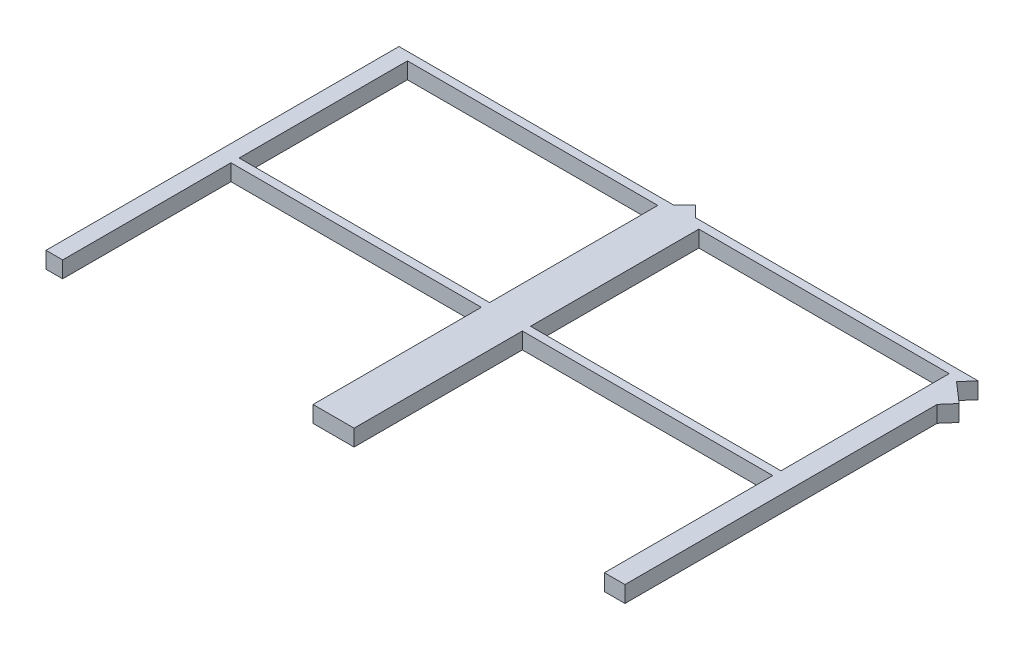
ISO-10303-21;
HEADER;
FILE_DESCRIPTION(('STEP AP214'),'2;1');
FILE_NAME('part.step','',(''),(''),'','','');
FILE_SCHEMA(('AUTOMOTIVE_DESIGN { 1 0 10303 214 1 1 1 1 }'));
ENDSEC;
DATA;
#1=APPLICATION_CONTEXT('core data for automotive mechanical design processes');
#2=APPLICATION_PROTOCOL_DEFINITION('international standard','automotive_design',2000,#1);
#3=PRODUCT_CONTEXT('',#1,'mechanical');
#4=PRODUCT('Part','Part','',(#3));
#5=PRODUCT_RELATED_PRODUCT_CATEGORY('part','',(#4));
#6=PRODUCT_DEFINITION_FORMATION('','',#4);
#7=PRODUCT_DEFINITION_CONTEXT('part definition',#1,'design');
#8=PRODUCT_DEFINITION('design','',#6,#7);
#9=PRODUCT_DEFINITION_SHAPE('','',#8);
#10=(LENGTH_UNIT() NAMED_UNIT(*) SI_UNIT(.MILLI.,.METRE.));
#11=(NAMED_UNIT(*) PLANE_ANGLE_UNIT() SI_UNIT($,.RADIAN.));
#12=(NAMED_UNIT(*) SI_UNIT($,.STERADIAN.) SOLID_ANGLE_UNIT());
#13=UNCERTAINTY_MEASURE_WITH_UNIT(LENGTH_MEASURE(1.E-05),#10,'distance_accuracy_value','');
#14=(GEOMETRIC_REPRESENTATION_CONTEXT(3) GLOBAL_UNCERTAINTY_ASSIGNED_CONTEXT((#13)) GLOBAL_UNIT_ASSIGNED_CONTEXT((#10,
#11,#12)) REPRESENTATION_CONTEXT('',''));
#15=CARTESIAN_POINT('',(0.,0.,0.));
#16=DIRECTION('',(0.,0.,1.));
#17=DIRECTION('',(1.,0.,0.));
#18=AXIS2_PLACEMENT_3D('',#15,#16,#17);
#19=CARTESIAN_POINT('',(0.,5.08,0.));
#20=DIRECTION('',(0.,-1.,0.));
#21=DIRECTION('',(0.,0.,-1.));
#22=AXIS2_PLACEMENT_3D('',#19,#20,#21);
#23=PLANE('',#22);
#24=DIRECTION('',(1.,0.,0.));
#25=VECTOR('',#24,1.);
#26=CARTESIAN_POINT('',(0.,5.08,55.88));
#27=LINE('',#26,#25);
#28=CARTESIAN_POINT('',(-55.88,5.08,55.88));
#29=VERTEX_POINT('',#28);
#30=CARTESIAN_POINT('',(21.59,5.08,55.88));
#31=VERTEX_POINT('',#30);
#32=EDGE_CURVE('E575',#29,#31,#27,.T.);
#33=ORIENTED_EDGE('',*,*,#32,.F.);
#34=DIRECTION('',(0.,0.,-1.));
#35=VECTOR('',#34,1.);
#36=CARTESIAN_POINT('',(-55.88,5.08,0.));
#37=LINE('',#36,#35);
#38=CARTESIAN_POINT('',(-55.88,5.08,3.81000000000004));
#39=VERTEX_POINT('',#38);
#40=EDGE_CURVE('E629',#29,#39,#37,.T.);
#41=ORIENTED_EDGE('',*,*,#40,.T.);
#42=DIRECTION('',(1.,0.,0.));
#43=VECTOR('',#42,1.);
#44=CARTESIAN_POINT('',(0.,5.08,3.81000000000004));
#45=LINE('',#44,#43);
#46=CARTESIAN_POINT('',(21.59,5.08,3.81000000000004));
#47=VERTEX_POINT('',#46);
#48=EDGE_CURVE('E621',#39,#47,#45,.T.);
#49=ORIENTED_EDGE('',*,*,#48,.T.);
#50=DIRECTION('',(0.,0.,-1.));
#51=VECTOR('',#50,1.);
#52=CARTESIAN_POINT('',(21.59,5.08,0.));
#53=LINE('',#52,#51);
#54=EDGE_CURVE('E611',#31,#47,#53,.T.);
#55=ORIENTED_EDGE('',*,*,#54,.F.);
#56=EDGE_LOOP('',(#33,#41,#49,#55));
#57=FACE_BOUND('',#56,.T.);
#58=DIRECTION('',(1.,0.,0.));
#59=VECTOR('',#58,1.);
#60=CARTESIAN_POINT('',(0.,5.08,3.81000000000004));
#61=LINE('',#60,#59);
#62=CARTESIAN_POINT('',(-146.05,5.08,3.81000000000004));
#63=VERTEX_POINT('',#62);
#64=CARTESIAN_POINT('',(-68.58,5.08,3.81000000000004));
#65=VERTEX_POINT('',#64);
#66=EDGE_CURVE('E666',#63,#65,#61,.T.);
#67=ORIENTED_EDGE('',*,*,#66,.T.);
#68=DIRECTION('',(0.,0.,1.));
#69=VECTOR('',#68,1.);
#70=CARTESIAN_POINT('',(-68.58,5.08,0.));
#71=LINE('',#70,#69);
#72=CARTESIAN_POINT('',(-68.58,5.08,55.88));
#73=VERTEX_POINT('',#72);
#74=EDGE_CURVE('E635',#65,#73,#71,.T.);
#75=ORIENTED_EDGE('',*,*,#74,.T.);
#76=DIRECTION('',(1.,0.,0.));
#77=VECTOR('',#76,1.);
#78=CARTESIAN_POINT('',(0.,5.08,55.88));
#79=LINE('',#78,#77);
#80=CARTESIAN_POINT('',(-146.05,5.08,55.88));
#81=VERTEX_POINT('',#80);
#82=EDGE_CURVE('E675',#81,#73,#79,.T.);
#83=ORIENTED_EDGE('',*,*,#82,.F.);
#84=DIRECTION('',(0.,0.,1.));
#85=VECTOR('',#84,1.);
#86=CARTESIAN_POINT('',(-146.05,5.08,0.));
#87=LINE('',#86,#85);
#88=EDGE_CURVE('E670',#63,#81,#87,.T.);
#89=ORIENTED_EDGE('',*,*,#88,.F.);
#90=EDGE_LOOP('',(#67,#75,#83,#89));
#91=FACE_BOUND('',#90,.T.);
#92=DIRECTION('',(1.,0.,0.));
#93=VECTOR('',#92,1.);
#94=CARTESIAN_POINT('',(0.,5.08,1.27000000000004));
#95=LINE('',#94,#93);
#96=CARTESIAN_POINT('',(-59.5068344591337,5.08,1.27000000000004));
#97=VERTEX_POINT('',#96);
#98=CARTESIAN_POINT('',(27.9587677142677,5.08,1.27000000000004));
#99=VERTEX_POINT('',#98);
#100=EDGE_CURVE('E649',#97,#99,#95,.T.);
#101=ORIENTED_EDGE('',*,*,#100,.F.);
#102=DIRECTION('',(0.707106781186548,0.,0.707106781186547));
#103=VECTOR('',#102,1.);
#104=CARTESIAN_POINT('',(-30.3884172295668,5.08,30.3884172295669));
#105=LINE('',#104,#103);
#106=CARTESIAN_POINT('',(-62.9343254452258,5.08,-2.15749098609207));
#107=VERTEX_POINT('',#106);
#108=EDGE_CURVE('E805',#107,#97,#105,.T.);
#109=ORIENTED_EDGE('',*,*,#108,.F.);
#110=DIRECTION('',(0.707106781186547,0.,-0.707106781186548));
#111=VECTOR('',#110,1.);
#112=CARTESIAN_POINT('',(-32.545908215659,5.08,-32.5459082156589));
#113=LINE('',#112,#111);
#114=CARTESIAN_POINT('',(-66.3618164313179,5.08,1.27000000000004));
#115=VERTEX_POINT('',#114);
#116=EDGE_CURVE('E809',#115,#107,#113,.T.);
#117=ORIENTED_EDGE('',*,*,#116,.F.);
#118=DIRECTION('',(1.,0.,0.));
#119=VECTOR('',#118,1.);
#120=CARTESIAN_POINT('',(0.,5.08,1.27000000000004));
#121=LINE('',#120,#119);
#122=CARTESIAN_POINT('',(-151.207591035533,5.08,1.27000000000004));
#123=VERTEX_POINT('',#122);
#124=EDGE_CURVE('E652',#123,#115,#121,.T.);
#125=ORIENTED_EDGE('',*,*,#124,.F.);
#126=DIRECTION('',(0.,0.,-1.));
#127=VECTOR('',#126,1.);
#128=CARTESIAN_POINT('',(-151.207591035533,5.08,110.49));
#129=LINE('',#128,#127);
#130=CARTESIAN_POINT('',(-151.207591035533,5.08,110.49));
#131=VERTEX_POINT('',#130);
#132=EDGE_CURVE('E698',#131,#123,#129,.T.);
#133=ORIENTED_EDGE('',*,*,#132,.F.);
#134=DIRECTION('',(-1.,0.,0.));
#135=VECTOR('',#134,1.);
#136=CARTESIAN_POINT('',(-146.05,5.08,110.49));
#137=LINE('',#136,#135);
#138=CARTESIAN_POINT('',(-146.05,5.08,110.49));
#139=VERTEX_POINT('',#138);
#140=EDGE_CURVE('E701',#139,#131,#137,.T.);
#141=ORIENTED_EDGE('',*,*,#140,.F.);
#142=DIRECTION('',(0.,0.,1.));
#143=VECTOR('',#142,1.);
#144=CARTESIAN_POINT('',(-146.05,5.08,58.42));
#145=LINE('',#144,#143);
#146=CARTESIAN_POINT('',(-146.05,5.08,58.42));
#147=VERTEX_POINT('',#146);
#148=EDGE_CURVE('E721',#147,#139,#145,.T.);
#149=ORIENTED_EDGE('',*,*,#148,.F.);
#150=DIRECTION('',(1.,0.,0.));
#151=VECTOR('',#150,1.);
#152=CARTESIAN_POINT('',(-146.05,5.08,58.42));
#153=LINE('',#152,#151);
#154=CARTESIAN_POINT('',(-68.58,5.08,58.42));
#155=VERTEX_POINT('',#154);
#156=EDGE_CURVE('E630',#147,#155,#153,.T.);
#157=ORIENTED_EDGE('',*,*,#156,.T.);
#158=DIRECTION('',(0.,0.,1.));
#159=VECTOR('',#158,1.);
#160=CARTESIAN_POINT('',(-68.58,5.08,58.42));
#161=LINE('',#160,#159);
#162=CARTESIAN_POINT('',(-68.58,5.08,110.49));
#163=VERTEX_POINT('',#162);
#164=EDGE_CURVE('E633',#155,#163,#161,.T.);
#165=ORIENTED_EDGE('',*,*,#164,.T.);
#166=DIRECTION('',(1.,0.,0.));
#167=VECTOR('',#166,1.);
#168=CARTESIAN_POINT('',(-68.58,5.08,110.49));
#169=LINE('',#168,#167);
#170=CARTESIAN_POINT('',(-55.88,5.08,110.49));
#171=VERTEX_POINT('',#170);
#172=EDGE_CURVE('E716',#163,#171,#169,.T.);
#173=ORIENTED_EDGE('',*,*,#172,.T.);
#174=DIRECTION('',(0.,0.,-1.));
#175=VECTOR('',#174,1.);
#176=CARTESIAN_POINT('',(-55.88,5.08,110.49));
#177=LINE('',#176,#175);
#178=CARTESIAN_POINT('',(-55.88,5.08,58.42));
#179=VERTEX_POINT('',#178);
#180=EDGE_CURVE('E713',#171,#179,#177,.T.);
#181=ORIENTED_EDGE('',*,*,#180,.T.);
#182=DIRECTION('',(1.,0.,0.));
#183=VECTOR('',#182,1.);
#184=CARTESIAN_POINT('',(-55.88,5.08,58.42));
#185=LINE('',#184,#183);
#186=CARTESIAN_POINT('',(21.59,5.08,58.42));
#187=VERTEX_POINT('',#186);
#188=EDGE_CURVE('E705',#179,#187,#185,.T.);
#189=ORIENTED_EDGE('',*,*,#188,.T.);
#190=DIRECTION('',(0.,0.,-1.));
#191=VECTOR('',#190,1.);
#192=CARTESIAN_POINT('',(21.59,5.08,110.49));
#193=LINE('',#192,#191);
#194=CARTESIAN_POINT('',(21.59,5.08,110.49));
#195=VERTEX_POINT('',#194);
#196=EDGE_CURVE('E706',#195,#187,#193,.T.);
#197=ORIENTED_EDGE('',*,*,#196,.F.);
#198=DIRECTION('',(1.,0.,0.));
#199=VECTOR('',#198,1.);
#200=CARTESIAN_POINT('',(21.59,5.08,110.49));
#201=LINE('',#200,#199);
#202=CARTESIAN_POINT('',(27.94,5.08,110.49));
#203=VERTEX_POINT('',#202);
#204=EDGE_CURVE('E657',#195,#203,#201,.T.);
#205=ORIENTED_EDGE('',*,*,#204,.T.);
#206=DIRECTION('',(-0.000171834041298596,0.,0.999999985236531));
#207=VECTOR('',#206,1.);
#208=CARTESIAN_POINT('',(27.9589851179601,5.08,0.00480430547435462));
#209=LINE('',#208,#207);
#210=CARTESIAN_POINT('',(27.9565958922878,5.08,13.9090669240136));
#211=VERTEX_POINT('',#210);
#212=EDGE_CURVE('E812',#211,#203,#209,.T.);
#213=ORIENTED_EDGE('',*,*,#212,.F.);
#214=DIRECTION('',(-0.65744277938189,0.,0.753504473668615));
#215=VECTOR('',#214,1.);
#216=CARTESIAN_POINT('',(22.7632463415981,5.08,19.8612383410435));
#217=LINE('',#216,#215);
#218=CARTESIAN_POINT('',(31.1243838571339,5.08,10.2784203065404));
#219=VERTEX_POINT('',#218);
#220=EDGE_CURVE('E815',#219,#211,#217,.T.);
#221=ORIENTED_EDGE('',*,*,#220,.F.);
#222=DIRECTION('',(0.753504473668615,0.,0.65744277938189));
#223=VECTOR('',#222,1.);
#224=CARTESIAN_POINT('',(8.36113751553571,5.08,-9.58281803450315));
#225=LINE('',#224,#223);
#226=CARTESIAN_POINT('',(24.8643991895312,5.08,4.81649955812195));
#227=VERTEX_POINT('',#226);
#228=EDGE_CURVE('E818',#227,#219,#225,.T.);
#229=ORIENTED_EDGE('',*,*,#228,.F.);
#230=DIRECTION('',(-0.65744277938189,0.,0.753504473668615));
#231=VECTOR('',#230,1.);
#232=CARTESIAN_POINT('',(16.5032616739955,5.08,14.3993175926251));
#233=LINE('',#232,#231);
#234=EDGE_CURVE('E821',#99,#227,#233,.T.);
#235=ORIENTED_EDGE('',*,*,#234,.F.);
#236=EDGE_LOOP('',(#101,#109,#117,#125,#133,#141,#149,#157,#165,#173,#181,#189,#197,#205,#213,
#221,#229,#235));
#237=FACE_BOUND('',#236,.T.);
#238=ADVANCED_FACE('F572',(#57,#91,#237),#23,.F.);
#239=CARTESIAN_POINT('',(0.,0.,0.));
#240=DIRECTION('',(0.,-1.,0.));
#241=DIRECTION('',(0.,0.,-1.));
#242=AXIS2_PLACEMENT_3D('',#239,#240,#241);
#243=PLANE('',#242);
#244=DIRECTION('',(0.707106781186548,0.,0.707106781186547));
#245=VECTOR('',#244,1.);
#246=CARTESIAN_POINT('',(-30.3884172295668,0.,30.3884172295669));
#247=LINE('',#246,#245);
#248=CARTESIAN_POINT('',(-62.9343254452258,0.,-2.15749098609207));
#249=VERTEX_POINT('',#248);
#250=CARTESIAN_POINT('',(-59.5068344591337,0.,1.27000000000004));
#251=VERTEX_POINT('',#250);
#252=EDGE_CURVE('E782',#249,#251,#247,.T.);
#253=ORIENTED_EDGE('',*,*,#252,.T.);
#254=DIRECTION('',(1.,0.,0.));
#255=VECTOR('',#254,1.);
#256=CARTESIAN_POINT('',(0.,0.,1.27000000000004));
#257=LINE('',#256,#255);
#258=CARTESIAN_POINT('',(27.9587677142677,0.,1.27000000000004));
#259=VERTEX_POINT('',#258);
#260=EDGE_CURVE('E653',#251,#259,#257,.T.);
#261=ORIENTED_EDGE('',*,*,#260,.T.);
#262=DIRECTION('',(-0.65744277938189,0.,0.753504473668615));
#263=VECTOR('',#262,1.);
#264=CARTESIAN_POINT('',(16.5032616739955,0.,14.3993175926251));
#265=LINE('',#264,#263);
#266=CARTESIAN_POINT('',(24.8643991895312,0.,4.81649955812195));
#267=VERTEX_POINT('',#266);
#268=EDGE_CURVE('E808',#259,#267,#265,.T.);
#269=ORIENTED_EDGE('',*,*,#268,.T.);
#270=DIRECTION('',(0.753504473668615,0.,0.65744277938189));
#271=VECTOR('',#270,1.);
#272=CARTESIAN_POINT('',(8.36113751553571,0.,-9.58281803450315));
#273=LINE('',#272,#271);
#274=CARTESIAN_POINT('',(31.1243838571339,0.,10.2784203065404));
#275=VERTEX_POINT('',#274);
#276=EDGE_CURVE('E835',#267,#275,#273,.T.);
#277=ORIENTED_EDGE('',*,*,#276,.T.);
#278=DIRECTION('',(-0.65744277938189,0.,0.753504473668615));
#279=VECTOR('',#278,1.);
#280=CARTESIAN_POINT('',(22.7632463415981,0.,19.8612383410435));
#281=LINE('',#280,#279);
#282=CARTESIAN_POINT('',(27.9565958922878,0.,13.9090669240136));
#283=VERTEX_POINT('',#282);
#284=EDGE_CURVE('E832',#275,#283,#281,.T.);
#285=ORIENTED_EDGE('',*,*,#284,.T.);
#286=DIRECTION('',(-0.000171834041298596,0.,0.999999985236531));
#287=VECTOR('',#286,1.);
#288=CARTESIAN_POINT('',(27.9589851179601,0.,0.00480430547435462));
#289=LINE('',#288,#287);
#290=CARTESIAN_POINT('',(27.94,0.,110.49));
#291=VERTEX_POINT('',#290);
#292=EDGE_CURVE('E829',#283,#291,#289,.T.);
#293=ORIENTED_EDGE('',*,*,#292,.T.);
#294=DIRECTION('',(1.,0.,0.));
#295=VECTOR('',#294,1.);
#296=CARTESIAN_POINT('',(21.59,0.,110.49));
#297=LINE('',#296,#295);
#298=CARTESIAN_POINT('',(21.59,0.,110.49));
#299=VERTEX_POINT('',#298);
#300=EDGE_CURVE('E731',#299,#291,#297,.T.);
#301=ORIENTED_EDGE('',*,*,#300,.F.);
#302=DIRECTION('',(0.,0.,-1.));
#303=VECTOR('',#302,1.);
#304=CARTESIAN_POINT('',(21.59,0.,110.49));
#305=LINE('',#304,#303);
#306=CARTESIAN_POINT('',(21.59,0.,58.42));
#307=VERTEX_POINT('',#306);
#308=EDGE_CURVE('E644',#299,#307,#305,.T.);
#309=ORIENTED_EDGE('',*,*,#308,.T.);
#310=DIRECTION('',(1.,0.,0.));
#311=VECTOR('',#310,1.);
#312=CARTESIAN_POINT('',(-55.88,0.,58.42));
#313=LINE('',#312,#311);
#314=CARTESIAN_POINT('',(-55.88,0.,58.42));
#315=VERTEX_POINT('',#314);
#316=EDGE_CURVE('E737',#315,#307,#313,.T.);
#317=ORIENTED_EDGE('',*,*,#316,.F.);
#318=DIRECTION('',(0.,0.,-1.));
#319=VECTOR('',#318,1.);
#320=CARTESIAN_POINT('',(-55.88,0.,110.49));
#321=LINE('',#320,#319);
#322=CARTESIAN_POINT('',(-55.88,0.,110.49));
#323=VERTEX_POINT('',#322);
#324=EDGE_CURVE('E741',#323,#315,#321,.T.);
#325=ORIENTED_EDGE('',*,*,#324,.F.);
#326=DIRECTION('',(1.,0.,0.));
#327=VECTOR('',#326,1.);
#328=CARTESIAN_POINT('',(-68.58,0.,110.49));
#329=LINE('',#328,#327);
#330=CARTESIAN_POINT('',(-68.58,0.,110.49));
#331=VERTEX_POINT('',#330);
#332=EDGE_CURVE('E745',#331,#323,#329,.T.);
#333=ORIENTED_EDGE('',*,*,#332,.F.);
#334=DIRECTION('',(0.,0.,1.));
#335=VECTOR('',#334,1.);
#336=CARTESIAN_POINT('',(-68.58,0.,58.42));
#337=LINE('',#336,#335);
#338=CARTESIAN_POINT('',(-68.58,0.,58.42));
#339=VERTEX_POINT('',#338);
#340=EDGE_CURVE('E749',#339,#331,#337,.T.);
#341=ORIENTED_EDGE('',*,*,#340,.F.);
#342=DIRECTION('',(1.,0.,0.));
#343=VECTOR('',#342,1.);
#344=CARTESIAN_POINT('',(-146.05,0.,58.42));
#345=LINE('',#344,#343);
#346=CARTESIAN_POINT('',(-146.05,0.,58.42));
#347=VERTEX_POINT('',#346);
#348=EDGE_CURVE('E753',#347,#339,#345,.T.);
#349=ORIENTED_EDGE('',*,*,#348,.F.);
#350=DIRECTION('',(0.,0.,1.));
#351=VECTOR('',#350,1.);
#352=CARTESIAN_POINT('',(-146.05,0.,58.42));
#353=LINE('',#352,#351);
#354=CARTESIAN_POINT('',(-146.05,0.,110.49));
#355=VERTEX_POINT('',#354);
#356=EDGE_CURVE('E736',#347,#355,#353,.T.);
#357=ORIENTED_EDGE('',*,*,#356,.T.);
#358=DIRECTION('',(-1.,0.,0.));
#359=VECTOR('',#358,1.);
#360=CARTESIAN_POINT('',(-146.05,0.,110.49));
#361=LINE('',#360,#359);
#362=CARTESIAN_POINT('',(-151.207591035533,0.,110.49));
#363=VERTEX_POINT('',#362);
#364=EDGE_CURVE('E730',#355,#363,#361,.T.);
#365=ORIENTED_EDGE('',*,*,#364,.T.);
#366=DIRECTION('',(0.,0.,-1.));
#367=VECTOR('',#366,1.);
#368=CARTESIAN_POINT('',(-151.207591035533,0.,110.49));
#369=LINE('',#368,#367);
#370=CARTESIAN_POINT('',(-151.207591035533,0.,1.27000000000004));
#371=VERTEX_POINT('',#370);
#372=EDGE_CURVE('E702',#363,#371,#369,.T.);
#373=ORIENTED_EDGE('',*,*,#372,.T.);
#374=DIRECTION('',(1.,0.,0.));
#375=VECTOR('',#374,1.);
#376=CARTESIAN_POINT('',(0.,0.,1.27000000000004));
#377=LINE('',#376,#375);
#378=CARTESIAN_POINT('',(-66.3618164313179,0.,1.27000000000004));
#379=VERTEX_POINT('',#378);
#380=EDGE_CURVE('E656',#371,#379,#377,.T.);
#381=ORIENTED_EDGE('',*,*,#380,.T.);
#382=DIRECTION('',(0.707106781186547,0.,-0.707106781186548));
#383=VECTOR('',#382,1.);
#384=CARTESIAN_POINT('',(-32.545908215659,0.,-32.5459082156589));
#385=LINE('',#384,#383);
#386=EDGE_CURVE('E826',#379,#249,#385,.T.);
#387=ORIENTED_EDGE('',*,*,#386,.T.);
#388=EDGE_LOOP('',(#253,#261,#269,#277,#285,#293,#301,#309,#317,#325,#333,#341,#349,#357,#365,
#373,#381,#387));
#389=FACE_BOUND('',#388,.T.);
#390=DIRECTION('',(0.,0.,-1.));
#391=VECTOR('',#390,1.);
#392=CARTESIAN_POINT('',(-55.88,0.,0.));
#393=LINE('',#392,#391);
#394=CARTESIAN_POINT('',(-55.88,0.,55.88));
#395=VERTEX_POINT('',#394);
#396=CARTESIAN_POINT('',(-55.88,0.,3.81000000000004));
#397=VERTEX_POINT('',#396);
#398=EDGE_CURVE('E581',#395,#397,#393,.T.);
#399=ORIENTED_EDGE('',*,*,#398,.F.);
#400=DIRECTION('',(1.,0.,0.));
#401=VECTOR('',#400,1.);
#402=CARTESIAN_POINT('',(0.,0.,55.88));
#403=LINE('',#402,#401);
#404=CARTESIAN_POINT('',(21.59,0.,55.88));
#405=VERTEX_POINT('',#404);
#406=EDGE_CURVE('E638',#395,#405,#403,.T.);
#407=ORIENTED_EDGE('',*,*,#406,.T.);
#408=DIRECTION('',(0.,0.,-1.));
#409=VECTOR('',#408,1.);
#410=CARTESIAN_POINT('',(21.59,0.,0.));
#411=LINE('',#410,#409);
#412=CARTESIAN_POINT('',(21.59,0.,3.81000000000004));
#413=VERTEX_POINT('',#412);
#414=EDGE_CURVE('E641',#405,#413,#411,.T.);
#415=ORIENTED_EDGE('',*,*,#414,.T.);
#416=DIRECTION('',(1.,0.,0.));
#417=VECTOR('',#416,1.);
#418=CARTESIAN_POINT('',(0.,0.,3.81000000000004));
#419=LINE('',#418,#417);
#420=EDGE_CURVE('E623',#397,#413,#419,.T.);
#421=ORIENTED_EDGE('',*,*,#420,.F.);
#422=EDGE_LOOP('',(#399,#407,#415,#421));
#423=FACE_BOUND('',#422,.T.);
#424=DIRECTION('',(0.,0.,1.));
#425=VECTOR('',#424,1.);
#426=CARTESIAN_POINT('',(-68.58,0.,0.));
#427=LINE('',#426,#425);
#428=CARTESIAN_POINT('',(-68.58,0.,3.81000000000004));
#429=VERTEX_POINT('',#428);
#430=CARTESIAN_POINT('',(-68.58,0.,55.88));
#431=VERTEX_POINT('',#430);
#432=EDGE_CURVE('E678',#429,#431,#427,.T.);
#433=ORIENTED_EDGE('',*,*,#432,.F.);
#434=DIRECTION('',(1.,0.,0.));
#435=VECTOR('',#434,1.);
#436=CARTESIAN_POINT('',(0.,0.,3.81000000000004));
#437=LINE('',#436,#435);
#438=CARTESIAN_POINT('',(-146.05,0.,3.81000000000004));
#439=VERTEX_POINT('',#438);
#440=EDGE_CURVE('E683',#439,#429,#437,.T.);
#441=ORIENTED_EDGE('',*,*,#440,.F.);
#442=DIRECTION('',(0.,0.,1.));
#443=VECTOR('',#442,1.);
#444=CARTESIAN_POINT('',(-146.05,0.,0.));
#445=LINE('',#444,#443);
#446=CARTESIAN_POINT('',(-146.05,0.,55.88));
#447=VERTEX_POINT('',#446);
#448=EDGE_CURVE('E663',#439,#447,#445,.T.);
#449=ORIENTED_EDGE('',*,*,#448,.T.);
#450=DIRECTION('',(1.,0.,0.));
#451=VECTOR('',#450,1.);
#452=CARTESIAN_POINT('',(0.,0.,55.88));
#453=LINE('',#452,#451);
#454=EDGE_CURVE('E642',#447,#431,#453,.T.);
#455=ORIENTED_EDGE('',*,*,#454,.T.);
#456=EDGE_LOOP('',(#433,#441,#449,#455));
#457=FACE_BOUND('',#456,.T.);
#458=ADVANCED_FACE('F842',(#389,#423,#457),#243,.T.);
#459=CARTESIAN_POINT('',(-151.207591035533,5.08,110.49));
#460=DIRECTION('',(-1.,0.,0.));
#461=DIRECTION('',(0.,0.,1.));
#462=AXIS2_PLACEMENT_3D('',#459,#460,#461);
#463=PLANE('',#462);
#464=DIRECTION('',(0.,1.,0.));
#465=VECTOR('',#464,1.);
#466=CARTESIAN_POINT('',(-151.207591035533,0.,1.27000000000004));
#467=LINE('',#466,#465);
#468=EDGE_CURVE('E794',#371,#123,#467,.T.);
#469=ORIENTED_EDGE('',*,*,#468,.F.);
#470=ORIENTED_EDGE('',*,*,#372,.F.);
#471=DIRECTION('',(0.,-1.,0.));
#472=VECTOR('',#471,1.);
#473=CARTESIAN_POINT('',(-151.207591035533,5.08,110.49));
#474=LINE('',#473,#472);
#475=EDGE_CURVE('E725',#131,#363,#474,.T.);
#476=ORIENTED_EDGE('',*,*,#475,.F.);
#477=ORIENTED_EDGE('',*,*,#132,.T.);
#478=EDGE_LOOP('',(#469,#470,#476,#477));
#479=FACE_BOUND('',#478,.T.);
#480=ADVANCED_FACE('F971',(#479),#463,.T.);
#481=CARTESIAN_POINT('',(-146.05,5.08,110.49));
#482=DIRECTION('',(0.,0.,1.));
#483=DIRECTION('',(1.,0.,0.));
#484=AXIS2_PLACEMENT_3D('',#481,#482,#483);
#485=PLANE('',#484);
#486=ORIENTED_EDGE('',*,*,#364,.F.);
#487=DIRECTION('',(0.,-1.,0.));
#488=VECTOR('',#487,1.);
#489=CARTESIAN_POINT('',(-146.05,5.08,110.49));
#490=LINE('',#489,#488);
#491=EDGE_CURVE('E724',#139,#355,#490,.T.);
#492=ORIENTED_EDGE('',*,*,#491,.F.);
#493=ORIENTED_EDGE('',*,*,#140,.T.);
#494=ORIENTED_EDGE('',*,*,#475,.T.);
#495=EDGE_LOOP('',(#486,#492,#493,#494));
#496=FACE_BOUND('',#495,.T.);
#497=ADVANCED_FACE('F976',(#496),#485,.T.);
#498=CARTESIAN_POINT('',(-146.05,5.08,58.42));
#499=DIRECTION('',(1.,0.,0.));
#500=DIRECTION('',(0.,0.,-1.));
#501=AXIS2_PLACEMENT_3D('',#498,#499,#500);
#502=PLANE('',#501);
#503=ORIENTED_EDGE('',*,*,#356,.F.);
#504=DIRECTION('',(0.,-1.,0.));
#505=VECTOR('',#504,1.);
#506=CARTESIAN_POINT('',(-146.05,5.08,58.42));
#507=LINE('',#506,#505);
#508=EDGE_CURVE('E752',#147,#347,#507,.T.);
#509=ORIENTED_EDGE('',*,*,#508,.F.);
#510=ORIENTED_EDGE('',*,*,#148,.T.);
#511=ORIENTED_EDGE('',*,*,#491,.T.);
#512=EDGE_LOOP('',(#503,#509,#510,#511));
#513=FACE_BOUND('',#512,.T.);
#514=ADVANCED_FACE('F1012',(#513),#502,.T.);
#515=CARTESIAN_POINT('',(-146.05,5.08,58.42));
#516=DIRECTION('',(0.,0.,-1.));
#517=DIRECTION('',(-1.,0.,0.));
#518=AXIS2_PLACEMENT_3D('',#515,#516,#517);
#519=PLANE('',#518);
#520=ORIENTED_EDGE('',*,*,#348,.T.);
#521=DIRECTION('',(0.,-1.,0.));
#522=VECTOR('',#521,1.);
#523=CARTESIAN_POINT('',(-68.58,5.08,58.42));
#524=LINE('',#523,#522);
#525=EDGE_CURVE('E748',#155,#339,#524,.T.);
#526=ORIENTED_EDGE('',*,*,#525,.F.);
#527=ORIENTED_EDGE('',*,*,#156,.F.);
#528=ORIENTED_EDGE('',*,*,#508,.T.);
#529=EDGE_LOOP('',(#520,#526,#527,#528));
#530=FACE_BOUND('',#529,.T.);
#531=ADVANCED_FACE('F1016',(#530),#519,.F.);
#532=CARTESIAN_POINT('',(-68.58,5.08,58.42));
#533=DIRECTION('',(1.,0.,0.));
#534=DIRECTION('',(0.,0.,-1.));
#535=AXIS2_PLACEMENT_3D('',#532,#533,#534);
#536=PLANE('',#535);
#537=ORIENTED_EDGE('',*,*,#340,.T.);
#538=DIRECTION('',(0.,-1.,0.));
#539=VECTOR('',#538,1.);
#540=CARTESIAN_POINT('',(-68.58,5.08,110.49));
#541=LINE('',#540,#539);
#542=EDGE_CURVE('E744',#163,#331,#541,.T.);
#543=ORIENTED_EDGE('',*,*,#542,.F.);
#544=ORIENTED_EDGE('',*,*,#164,.F.);
#545=ORIENTED_EDGE('',*,*,#525,.T.);
#546=EDGE_LOOP('',(#537,#543,#544,#545));
#547=FACE_BOUND('',#546,.T.);
#548=ADVANCED_FACE('F1020',(#547),#536,.F.);
#549=CARTESIAN_POINT('',(-68.58,5.08,110.49));
#550=DIRECTION('',(0.,0.,-1.));
#551=DIRECTION('',(-1.,0.,0.));
#552=AXIS2_PLACEMENT_3D('',#549,#550,#551);
#553=PLANE('',#552);
#554=ORIENTED_EDGE('',*,*,#332,.T.);
#555=DIRECTION('',(0.,-1.,0.));
#556=VECTOR('',#555,1.);
#557=CARTESIAN_POINT('',(-55.88,5.08,110.49));
#558=LINE('',#557,#556);
#559=EDGE_CURVE('E740',#171,#323,#558,.T.);
#560=ORIENTED_EDGE('',*,*,#559,.F.);
#561=ORIENTED_EDGE('',*,*,#172,.F.);
#562=ORIENTED_EDGE('',*,*,#542,.T.);
#563=EDGE_LOOP('',(#554,#560,#561,#562));
#564=FACE_BOUND('',#563,.T.);
#565=ADVANCED_FACE('F1024',(#564),#553,.F.);
#566=CARTESIAN_POINT('',(-55.88,5.08,110.49));
#567=DIRECTION('',(-1.,0.,0.));
#568=DIRECTION('',(0.,0.,1.));
#569=AXIS2_PLACEMENT_3D('',#566,#567,#568);
#570=PLANE('',#569);
#571=ORIENTED_EDGE('',*,*,#324,.T.);
#572=DIRECTION('',(0.,-1.,0.));
#573=VECTOR('',#572,1.);
#574=CARTESIAN_POINT('',(-55.88,5.08,58.42));
#575=LINE('',#574,#573);
#576=EDGE_CURVE('E710',#179,#315,#575,.T.);
#577=ORIENTED_EDGE('',*,*,#576,.F.);
#578=ORIENTED_EDGE('',*,*,#180,.F.);
#579=ORIENTED_EDGE('',*,*,#559,.T.);
#580=EDGE_LOOP('',(#571,#577,#578,#579));
#581=FACE_BOUND('',#580,.T.);
#582=ADVANCED_FACE('F1028',(#581),#570,.F.);
#583=CARTESIAN_POINT('',(-55.88,5.08,58.42));
#584=DIRECTION('',(0.,0.,-1.));
#585=DIRECTION('',(-1.,0.,0.));
#586=AXIS2_PLACEMENT_3D('',#583,#584,#585);
#587=PLANE('',#586);
#588=ORIENTED_EDGE('',*,*,#316,.T.);
#589=DIRECTION('',(0.,-1.,0.));
#590=VECTOR('',#589,1.);
#591=CARTESIAN_POINT('',(21.59,5.08,58.42));
#592=LINE('',#591,#590);
#593=EDGE_CURVE('E709',#187,#307,#592,.T.);
#594=ORIENTED_EDGE('',*,*,#593,.F.);
#595=ORIENTED_EDGE('',*,*,#188,.F.);
#596=ORIENTED_EDGE('',*,*,#576,.T.);
#597=EDGE_LOOP('',(#588,#594,#595,#596));
#598=FACE_BOUND('',#597,.T.);
#599=ADVANCED_FACE('F1032',(#598),#587,.F.);
#600=CARTESIAN_POINT('',(21.59,5.08,110.49));
#601=DIRECTION('',(-1.,0.,0.));
#602=DIRECTION('',(0.,0.,1.));
#603=AXIS2_PLACEMENT_3D('',#600,#601,#602);
#604=PLANE('',#603);
#605=ORIENTED_EDGE('',*,*,#308,.F.);
#606=DIRECTION('',(0.,-1.,0.));
#607=VECTOR('',#606,1.);
#608=CARTESIAN_POINT('',(21.59,5.08,110.49));
#609=LINE('',#608,#607);
#610=EDGE_CURVE('E682',#195,#299,#609,.T.);
#611=ORIENTED_EDGE('',*,*,#610,.F.);
#612=ORIENTED_EDGE('',*,*,#196,.T.);
#613=ORIENTED_EDGE('',*,*,#593,.T.);
#614=EDGE_LOOP('',(#605,#611,#612,#613));
#615=FACE_BOUND('',#614,.T.);
#616=ADVANCED_FACE('F1036',(#615),#604,.T.);
#617=CARTESIAN_POINT('',(21.59,5.08,110.49));
#618=DIRECTION('',(0.,0.,-1.));
#619=DIRECTION('',(-1.,0.,0.));
#620=AXIS2_PLACEMENT_3D('',#617,#618,#619);
#621=PLANE('',#620);
#622=ORIENTED_EDGE('',*,*,#300,.T.);
#623=DIRECTION('',(0.,1.,0.));
#624=VECTOR('',#623,1.);
#625=CARTESIAN_POINT('',(27.94,0.,110.49));
#626=LINE('',#625,#624);
#627=EDGE_CURVE('E791',#291,#203,#626,.T.);
#628=ORIENTED_EDGE('',*,*,#627,.T.);
#629=ORIENTED_EDGE('',*,*,#204,.F.);
#630=ORIENTED_EDGE('',*,*,#610,.T.);
#631=EDGE_LOOP('',(#622,#628,#629,#630));
#632=FACE_BOUND('',#631,.T.);
#633=ADVANCED_FACE('F1009',(#632),#621,.F.);
#634=CARTESIAN_POINT('',(-68.58,5.08,0.));
#635=DIRECTION('',(1.,0.,0.));
#636=DIRECTION('',(0.,0.,-1.));
#637=AXIS2_PLACEMENT_3D('',#634,#635,#636);
#638=PLANE('',#637);
#639=ORIENTED_EDGE('',*,*,#432,.T.);
#640=DIRECTION('',(0.,-1.,0.));
#641=VECTOR('',#640,1.);
#642=CARTESIAN_POINT('',(-68.58,5.08,55.88));
#643=LINE('',#642,#641);
#644=EDGE_CURVE('E660',#73,#431,#643,.T.);
#645=ORIENTED_EDGE('',*,*,#644,.F.);
#646=ORIENTED_EDGE('',*,*,#74,.F.);
#647=DIRECTION('',(0.,-1.,0.));
#648=VECTOR('',#647,1.);
#649=CARTESIAN_POINT('',(-68.58,5.08,3.81000000000004));
#650=LINE('',#649,#648);
#651=EDGE_CURVE('E681',#65,#429,#650,.T.);
#652=ORIENTED_EDGE('',*,*,#651,.T.);
#653=EDGE_LOOP('',(#639,#645,#646,#652));
#654=FACE_BOUND('',#653,.T.);
#655=ADVANCED_FACE('F967',(#654),#638,.F.);
#656=CARTESIAN_POINT('',(0.,5.08,3.81000000000004));
#657=DIRECTION('',(0.,0.,-1.));
#658=DIRECTION('',(-1.,0.,0.));
#659=AXIS2_PLACEMENT_3D('',#656,#657,#658);
#660=PLANE('',#659);
#661=ORIENTED_EDGE('',*,*,#440,.T.);
#662=ORIENTED_EDGE('',*,*,#651,.F.);
#663=ORIENTED_EDGE('',*,*,#66,.F.);
#664=DIRECTION('',(0.,-1.,0.));
#665=VECTOR('',#664,1.);
#666=CARTESIAN_POINT('',(-146.05,5.08,3.81000000000004));
#667=LINE('',#666,#665);
#668=EDGE_CURVE('E674',#63,#439,#667,.T.);
#669=ORIENTED_EDGE('',*,*,#668,.T.);
#670=EDGE_LOOP('',(#661,#662,#663,#669));
#671=FACE_BOUND('',#670,.T.);
#672=ADVANCED_FACE('F959',(#671),#660,.F.);
#673=CARTESIAN_POINT('',(-146.05,5.08,0.));
#674=DIRECTION('',(1.,0.,0.));
#675=DIRECTION('',(0.,0.,-1.));
#676=AXIS2_PLACEMENT_3D('',#673,#674,#675);
#677=PLANE('',#676);
#678=ORIENTED_EDGE('',*,*,#448,.F.);
#679=ORIENTED_EDGE('',*,*,#668,.F.);
#680=ORIENTED_EDGE('',*,*,#88,.T.);
#681=DIRECTION('',(0.,-1.,0.));
#682=VECTOR('',#681,1.);
#683=CARTESIAN_POINT('',(-146.05,5.08,55.88));
#684=LINE('',#683,#682);
#685=EDGE_CURVE('E673',#81,#447,#684,.T.);
#686=ORIENTED_EDGE('',*,*,#685,.T.);
#687=EDGE_LOOP('',(#678,#679,#680,#686));
#688=FACE_BOUND('',#687,.T.);
#689=ADVANCED_FACE('F953',(#688),#677,.T.);
#690=CARTESIAN_POINT('',(0.,5.08,55.88));
#691=DIRECTION('',(0.,0.,-1.));
#692=DIRECTION('',(-1.,0.,0.));
#693=AXIS2_PLACEMENT_3D('',#690,#691,#692);
#694=PLANE('',#693);
#695=ORIENTED_EDGE('',*,*,#454,.F.);
#696=ORIENTED_EDGE('',*,*,#685,.F.);
#697=ORIENTED_EDGE('',*,*,#82,.T.);
#698=ORIENTED_EDGE('',*,*,#644,.T.);
#699=EDGE_LOOP('',(#695,#696,#697,#698));
#700=FACE_BOUND('',#699,.T.);
#701=ADVANCED_FACE('F965',(#700),#694,.T.);
#702=CARTESIAN_POINT('',(0.,5.08,1.27000000000004));
#703=DIRECTION('',(0.,0.,-1.));
#704=DIRECTION('',(-1.,0.,0.));
#705=AXIS2_PLACEMENT_3D('',#702,#703,#704);
#706=PLANE('',#705);
#707=ORIENTED_EDGE('',*,*,#380,.F.);
#708=ORIENTED_EDGE('',*,*,#468,.T.);
#709=ORIENTED_EDGE('',*,*,#124,.T.);
#710=DIRECTION('',(0.,1.,0.));
#711=VECTOR('',#710,1.);
#712=CARTESIAN_POINT('',(-66.3618164313179,0.,1.27000000000004));
#713=LINE('',#712,#711);
#714=EDGE_CURVE('E797',#379,#115,#713,.T.);
#715=ORIENTED_EDGE('',*,*,#714,.F.);
#716=EDGE_LOOP('',(#707,#708,#709,#715));
#717=FACE_BOUND('',#716,.T.);
#718=ADVANCED_FACE('F996',(#717),#706,.T.);
#719=CARTESIAN_POINT('',(0.,5.08,1.27000000000004));
#720=DIRECTION('',(0.,0.,-1.));
#721=DIRECTION('',(-1.,0.,0.));
#722=AXIS2_PLACEMENT_3D('',#719,#720,#721);
#723=PLANE('',#722);
#724=ORIENTED_EDGE('',*,*,#260,.F.);
#725=DIRECTION('',(0.,1.,0.));
#726=VECTOR('',#725,1.);
#727=CARTESIAN_POINT('',(-59.5068344591337,0.,1.27000000000004));
#728=LINE('',#727,#726);
#729=EDGE_CURVE('E669',#251,#97,#728,.T.);
#730=ORIENTED_EDGE('',*,*,#729,.T.);
#731=ORIENTED_EDGE('',*,*,#100,.T.);
#732=DIRECTION('',(0.,1.,0.));
#733=VECTOR('',#732,1.);
#734=CARTESIAN_POINT('',(27.9587677142677,0.,1.27000000000004));
#735=LINE('',#734,#733);
#736=EDGE_CURVE('E778',#259,#99,#735,.T.);
#737=ORIENTED_EDGE('',*,*,#736,.F.);
#738=EDGE_LOOP('',(#724,#730,#731,#737));
#739=FACE_BOUND('',#738,.T.);
#740=ADVANCED_FACE('F992',(#739),#723,.T.);
#741=CARTESIAN_POINT('',(0.,5.08,55.88));
#742=DIRECTION('',(0.,0.,-1.));
#743=DIRECTION('',(-1.,0.,0.));
#744=AXIS2_PLACEMENT_3D('',#741,#742,#743);
#745=PLANE('',#744);
#746=ORIENTED_EDGE('',*,*,#406,.F.);
#747=DIRECTION('',(0.,-1.,0.));
#748=VECTOR('',#747,1.);
#749=CARTESIAN_POINT('',(-55.88,5.08,55.88));
#750=LINE('',#749,#748);
#751=EDGE_CURVE('E12',#29,#395,#750,.T.);
#752=ORIENTED_EDGE('',*,*,#751,.F.);
#753=ORIENTED_EDGE('',*,*,#32,.T.);
#754=DIRECTION('',(0.,-1.,0.));
#755=VECTOR('',#754,1.);
#756=CARTESIAN_POINT('',(21.59,5.08,55.88));
#757=LINE('',#756,#755);
#758=EDGE_CURVE('E616',#31,#405,#757,.T.);
#759=ORIENTED_EDGE('',*,*,#758,.T.);
#760=EDGE_LOOP('',(#746,#752,#753,#759));
#761=FACE_BOUND('',#760,.T.);
#762=ADVANCED_FACE('F989',(#761),#745,.T.);
#763=CARTESIAN_POINT('',(21.59,5.08,0.));
#764=DIRECTION('',(-1.,0.,0.));
#765=DIRECTION('',(0.,0.,1.));
#766=AXIS2_PLACEMENT_3D('',#763,#764,#765);
#767=PLANE('',#766);
#768=ORIENTED_EDGE('',*,*,#414,.F.);
#769=ORIENTED_EDGE('',*,*,#758,.F.);
#770=ORIENTED_EDGE('',*,*,#54,.T.);
#771=DIRECTION('',(0.,-1.,0.));
#772=VECTOR('',#771,1.);
#773=CARTESIAN_POINT('',(21.59,5.08,3.81000000000004));
#774=LINE('',#773,#772);
#775=EDGE_CURVE('E614',#47,#413,#774,.T.);
#776=ORIENTED_EDGE('',*,*,#775,.T.);
#777=EDGE_LOOP('',(#768,#769,#770,#776));
#778=FACE_BOUND('',#777,.T.);
#779=ADVANCED_FACE('F613',(#778),#767,.T.);
#780=CARTESIAN_POINT('',(0.,5.08,3.81000000000004));
#781=DIRECTION('',(0.,0.,-1.));
#782=DIRECTION('',(-1.,0.,0.));
#783=AXIS2_PLACEMENT_3D('',#780,#781,#782);
#784=PLANE('',#783);
#785=ORIENTED_EDGE('',*,*,#420,.T.);
#786=ORIENTED_EDGE('',*,*,#775,.F.);
#787=ORIENTED_EDGE('',*,*,#48,.F.);
#788=DIRECTION('',(0.,-1.,0.));
#789=VECTOR('',#788,1.);
#790=CARTESIAN_POINT('',(-55.88,5.08,3.81000000000004));
#791=LINE('',#790,#789);
#792=EDGE_CURVE('E590',#39,#397,#791,.T.);
#793=ORIENTED_EDGE('',*,*,#792,.T.);
#794=EDGE_LOOP('',(#785,#786,#787,#793));
#795=FACE_BOUND('',#794,.T.);
#796=ADVANCED_FACE('F620',(#795),#784,.F.);
#797=CARTESIAN_POINT('',(-55.88,5.08,0.));
#798=DIRECTION('',(-1.,0.,0.));
#799=DIRECTION('',(0.,0.,1.));
#800=AXIS2_PLACEMENT_3D('',#797,#798,#799);
#801=PLANE('',#800);
#802=ORIENTED_EDGE('',*,*,#398,.T.);
#803=ORIENTED_EDGE('',*,*,#792,.F.);
#804=ORIENTED_EDGE('',*,*,#40,.F.);
#805=ORIENTED_EDGE('',*,*,#751,.T.);
#806=EDGE_LOOP('',(#802,#803,#804,#805));
#807=FACE_BOUND('',#806,.T.);
#808=ADVANCED_FACE('F980',(#807),#801,.F.);
#809=CARTESIAN_POINT('',(-32.545908215659,0.,-32.5459082156589));
#810=DIRECTION('',(0.707106781186548,0.,0.707106781186547));
#811=DIRECTION('',(0.707106781186547,0.,-0.707106781186548));
#812=AXIS2_PLACEMENT_3D('',#809,#810,#811);
#813=PLANE('',#812);
#814=ORIENTED_EDGE('',*,*,#116,.T.);
#815=DIRECTION('',(0.,1.,0.));
#816=VECTOR('',#815,1.);
#817=CARTESIAN_POINT('',(-62.9343254452258,0.,-2.15749098609207));
#818=LINE('',#817,#816);
#819=EDGE_CURVE('E800',#249,#107,#818,.T.);
#820=ORIENTED_EDGE('',*,*,#819,.F.);
#821=ORIENTED_EDGE('',*,*,#386,.F.);
#822=ORIENTED_EDGE('',*,*,#714,.T.);
#823=EDGE_LOOP('',(#814,#820,#821,#822));
#824=FACE_BOUND('',#823,.T.);
#825=ADVANCED_FACE('F983',(#824),#813,.F.);
#826=CARTESIAN_POINT('',(-30.3884172295668,0.,30.3884172295669));
#827=DIRECTION('',(-0.707106781186547,0.,0.707106781186548));
#828=DIRECTION('',(0.707106781186548,0.,0.707106781186547));
#829=AXIS2_PLACEMENT_3D('',#826,#827,#828);
#830=PLANE('',#829);
#831=ORIENTED_EDGE('',*,*,#108,.T.);
#832=ORIENTED_EDGE('',*,*,#729,.F.);
#833=ORIENTED_EDGE('',*,*,#252,.F.);
#834=ORIENTED_EDGE('',*,*,#819,.T.);
#835=EDGE_LOOP('',(#831,#832,#833,#834));
#836=FACE_BOUND('',#835,.T.);
#837=ADVANCED_FACE('F1057',(#836),#830,.F.);
#838=CARTESIAN_POINT('',(27.9589851179601,0.,0.00480430547435462));
#839=DIRECTION('',(-0.999999985236531,0.,-0.000171834041298596));
#840=DIRECTION('',(-0.000171834041298596,0.,0.999999985236531));
#841=AXIS2_PLACEMENT_3D('',#838,#839,#840);
#842=PLANE('',#841);
#843=ORIENTED_EDGE('',*,*,#212,.T.);
#844=ORIENTED_EDGE('',*,*,#627,.F.);
#845=ORIENTED_EDGE('',*,*,#292,.F.);
#846=DIRECTION('',(0.,1.,0.));
#847=VECTOR('',#846,1.);
#848=CARTESIAN_POINT('',(27.9565958922878,0.,13.9090669240136));
#849=LINE('',#848,#847);
#850=EDGE_CURVE('E788',#283,#211,#849,.T.);
#851=ORIENTED_EDGE('',*,*,#850,.T.);
#852=EDGE_LOOP('',(#843,#844,#845,#851));
#853=FACE_BOUND('',#852,.T.);
#854=ADVANCED_FACE('F1047',(#853),#842,.F.);
#855=CARTESIAN_POINT('',(16.5032616739955,0.,14.3993175926251));
#856=DIRECTION('',(-0.753504473668615,0.,-0.65744277938189));
#857=DIRECTION('',(-0.65744277938189,0.,0.753504473668615));
#858=AXIS2_PLACEMENT_3D('',#855,#856,#857);
#859=PLANE('',#858);
#860=ORIENTED_EDGE('',*,*,#234,.T.);
#861=DIRECTION('',(0.,1.,0.));
#862=VECTOR('',#861,1.);
#863=CARTESIAN_POINT('',(24.8643991895312,0.,4.81649955812195));
#864=LINE('',#863,#862);
#865=EDGE_CURVE('E781',#267,#227,#864,.T.);
#866=ORIENTED_EDGE('',*,*,#865,.F.);
#867=ORIENTED_EDGE('',*,*,#268,.F.);
#868=ORIENTED_EDGE('',*,*,#736,.T.);
#869=EDGE_LOOP('',(#860,#866,#867,#868));
#870=FACE_BOUND('',#869,.T.);
#871=ADVANCED_FACE('F852',(#870),#859,.F.);
#872=CARTESIAN_POINT('',(8.36113751553571,0.,-9.58281803450315));
#873=DIRECTION('',(-0.65744277938189,0.,0.753504473668615));
#874=DIRECTION('',(0.753504473668615,0.,0.65744277938189));
#875=AXIS2_PLACEMENT_3D('',#872,#873,#874);
#876=PLANE('',#875);
#877=ORIENTED_EDGE('',*,*,#228,.T.);
#878=DIRECTION('',(0.,1.,0.));
#879=VECTOR('',#878,1.);
#880=CARTESIAN_POINT('',(31.1243838571339,0.,10.2784203065404));
#881=LINE('',#880,#879);
#882=EDGE_CURVE('E785',#275,#219,#881,.T.);
#883=ORIENTED_EDGE('',*,*,#882,.F.);
#884=ORIENTED_EDGE('',*,*,#276,.F.);
#885=ORIENTED_EDGE('',*,*,#865,.T.);
#886=EDGE_LOOP('',(#877,#883,#884,#885));
#887=FACE_BOUND('',#886,.T.);
#888=ADVANCED_FACE('F1046',(#887),#876,.F.);
#889=CARTESIAN_POINT('',(22.7632463415981,0.,19.8612383410435));
#890=DIRECTION('',(-0.753504473668615,0.,-0.65744277938189));
#891=DIRECTION('',(-0.65744277938189,0.,0.753504473668615));
#892=AXIS2_PLACEMENT_3D('',#889,#890,#891);
#893=PLANE('',#892);
#894=ORIENTED_EDGE('',*,*,#220,.T.);
#895=ORIENTED_EDGE('',*,*,#850,.F.);
#896=ORIENTED_EDGE('',*,*,#284,.F.);
#897=ORIENTED_EDGE('',*,*,#882,.T.);
#898=EDGE_LOOP('',(#894,#895,#896,#897));
#899=FACE_BOUND('',#898,.T.);
#900=ADVANCED_FACE('F1050',(#899),#893,.F.);
#901=CLOSED_SHELL('',(#238,#458,#480,#497,#514,#531,#548,#565,#582,#599,#616,#633,#655,#672,
#689,#701,#718,#740,#762,#779,#796,#808,#825,#837,#854,#871,#888,#900));
#902=MANIFOLD_SOLID_BREP('B2',#901);
#903=ADVANCED_BREP_SHAPE_REPRESENTATION('',(#18,#902),#14);
#904=SHAPE_DEFINITION_REPRESENTATION(#9,#903);
ENDSEC;
END-ISO-10303-21;
